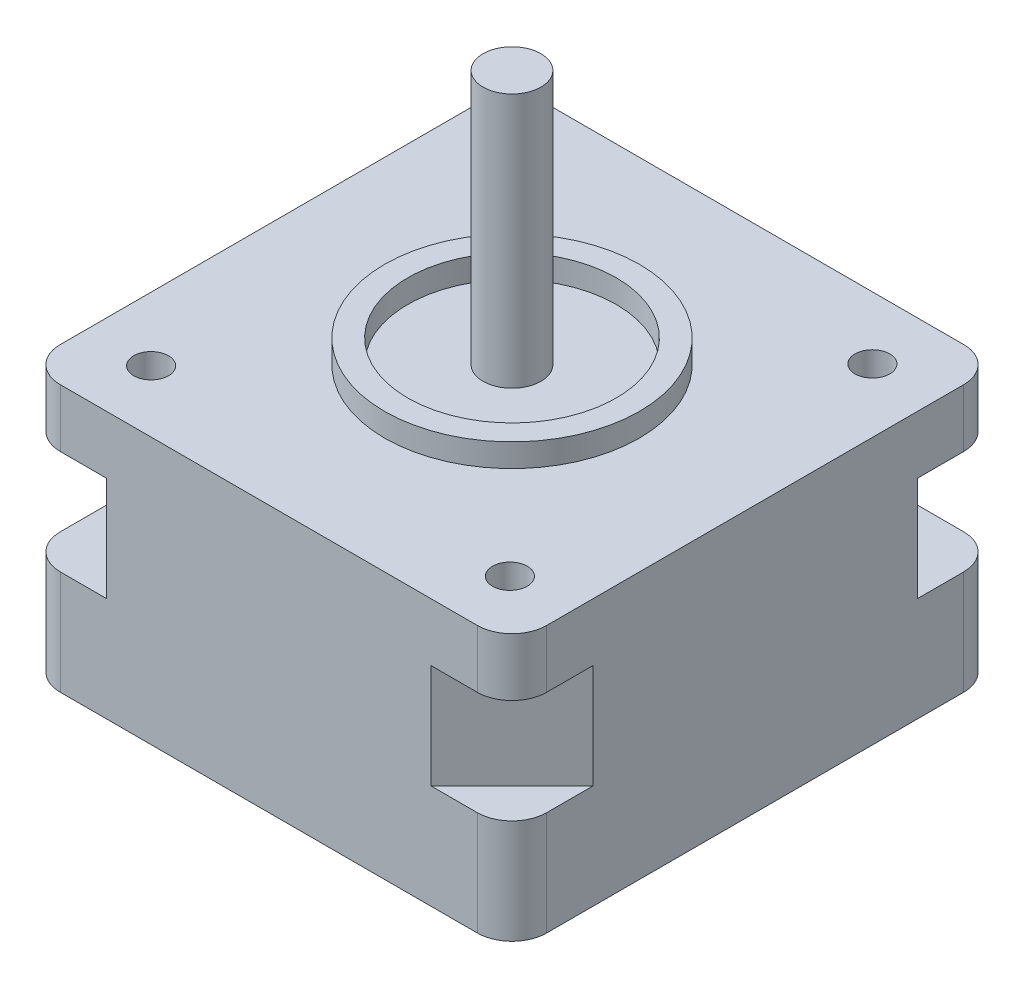
ISO-10303-21;
HEADER;
FILE_DESCRIPTION(('STEP AP214'),'2;1');
FILE_NAME('part.step','',(''),(''),'','','');
FILE_SCHEMA(('AUTOMOTIVE_DESIGN { 1 0 10303 214 1 1 1 1 }'));
ENDSEC;
DATA;
#1=APPLICATION_CONTEXT('core data for automotive mechanical design processes');
#2=APPLICATION_PROTOCOL_DEFINITION('international standard','automotive_design',2000,#1);
#3=PRODUCT_CONTEXT('',#1,'mechanical');
#4=PRODUCT('Part','Part','',(#3));
#5=PRODUCT_RELATED_PRODUCT_CATEGORY('part','',(#4));
#6=PRODUCT_DEFINITION_FORMATION('','',#4);
#7=PRODUCT_DEFINITION_CONTEXT('part definition',#1,'design');
#8=PRODUCT_DEFINITION('design','',#6,#7);
#9=PRODUCT_DEFINITION_SHAPE('','',#8);
#10=(LENGTH_UNIT() NAMED_UNIT(*) SI_UNIT(.MILLI.,.METRE.));
#11=(NAMED_UNIT(*) PLANE_ANGLE_UNIT() SI_UNIT($,.RADIAN.));
#12=(NAMED_UNIT(*) SI_UNIT($,.STERADIAN.) SOLID_ANGLE_UNIT());
#13=UNCERTAINTY_MEASURE_WITH_UNIT(LENGTH_MEASURE(1.E-05),#10,'distance_accuracy_value','');
#14=(GEOMETRIC_REPRESENTATION_CONTEXT(3) GLOBAL_UNCERTAINTY_ASSIGNED_CONTEXT((#13)) GLOBAL_UNIT_ASSIGNED_CONTEXT((#10,
#11,#12)) REPRESENTATION_CONTEXT('',''));
#15=CARTESIAN_POINT('',(0.,0.,0.));
#16=DIRECTION('',(0.,0.,1.));
#17=DIRECTION('',(1.,0.,0.));
#18=AXIS2_PLACEMENT_3D('',#15,#16,#17);
#19=CARTESIAN_POINT('',(-18.,9.,-21.));
#20=DIRECTION('',(0.,0.,1.));
#21=DIRECTION('',(1.,0.,0.));
#22=AXIS2_PLACEMENT_3D('',#19,#20,#21);
#23=PLANE('',#22);
#24=DIRECTION('',(-1.,0.,0.));
#25=VECTOR('',#24,1.);
#26=CARTESIAN_POINT('',(-18.,0.,-21.));
#27=LINE('',#26,#25);
#28=CARTESIAN_POINT('',(18.,0.,-21.));
#29=VERTEX_POINT('',#28);
#30=CARTESIAN_POINT('',(-18.,0.,-21.));
#31=VERTEX_POINT('',#30);
#32=EDGE_CURVE('E508',#29,#31,#27,.T.);
#33=ORIENTED_EDGE('',*,*,#32,.T.);
#34=DIRECTION('',(0.,-1.,0.));
#35=VECTOR('',#34,1.);
#36=CARTESIAN_POINT('',(-18.,9.,-21.));
#37=LINE('',#36,#35);
#38=CARTESIAN_POINT('',(-18.,9.,-21.));
#39=VERTEX_POINT('',#38);
#40=EDGE_CURVE('E523',#39,#31,#37,.T.);
#41=ORIENTED_EDGE('',*,*,#40,.F.);
#42=DIRECTION('',(-1.,0.,0.));
#43=VECTOR('',#42,1.);
#44=CARTESIAN_POINT('',(-18.,9.,-21.));
#45=LINE('',#44,#43);
#46=CARTESIAN_POINT('',(-14.,9.,-21.));
#47=VERTEX_POINT('',#46);
#48=EDGE_CURVE('E481',#47,#39,#45,.T.);
#49=ORIENTED_EDGE('',*,*,#48,.F.);
#50=DIRECTION('',(0.,-1.,0.));
#51=VECTOR('',#50,1.);
#52=CARTESIAN_POINT('',(-14.,18.,-21.));
#53=LINE('',#52,#51);
#54=CARTESIAN_POINT('',(-14.,18.,-21.));
#55=VERTEX_POINT('',#54);
#56=EDGE_CURVE('E457',#55,#47,#53,.T.);
#57=ORIENTED_EDGE('',*,*,#56,.F.);
#58=DIRECTION('',(-1.,0.,0.));
#59=VECTOR('',#58,1.);
#60=CARTESIAN_POINT('',(-18.,18.,-21.));
#61=LINE('',#60,#59);
#62=CARTESIAN_POINT('',(-18.,18.,-21.));
#63=VERTEX_POINT('',#62);
#64=EDGE_CURVE('E338',#55,#63,#61,.T.);
#65=ORIENTED_EDGE('',*,*,#64,.T.);
#66=DIRECTION('',(0.,-1.,0.));
#67=VECTOR('',#66,1.);
#68=CARTESIAN_POINT('',(-18.,23.,-21.));
#69=LINE('',#68,#67);
#70=CARTESIAN_POINT('',(-18.,23.,-21.));
#71=VERTEX_POINT('',#70);
#72=EDGE_CURVE('E389',#71,#63,#69,.T.);
#73=ORIENTED_EDGE('',*,*,#72,.F.);
#74=DIRECTION('',(-1.,0.,0.));
#75=VECTOR('',#74,1.);
#76=CARTESIAN_POINT('',(-18.,23.,-21.));
#77=LINE('',#76,#75);
#78=CARTESIAN_POINT('',(18.,23.,-21.));
#79=VERTEX_POINT('',#78);
#80=EDGE_CURVE('E312',#79,#71,#77,.T.);
#81=ORIENTED_EDGE('',*,*,#80,.F.);
#82=DIRECTION('',(0.,-1.,0.));
#83=VECTOR('',#82,1.);
#84=CARTESIAN_POINT('',(18.,23.,-21.));
#85=LINE('',#84,#83);
#86=CARTESIAN_POINT('',(18.,18.,-21.));
#87=VERTEX_POINT('',#86);
#88=EDGE_CURVE('E393',#79,#87,#85,.T.);
#89=ORIENTED_EDGE('',*,*,#88,.T.);
#90=CARTESIAN_POINT('',(14.,18.,-21.));
#91=VERTEX_POINT('',#90);
#92=EDGE_CURVE('E339',#87,#91,#61,.T.);
#93=ORIENTED_EDGE('',*,*,#92,.T.);
#94=DIRECTION('',(0.,-1.,0.));
#95=VECTOR('',#94,1.);
#96=CARTESIAN_POINT('',(14.,18.,-21.));
#97=LINE('',#96,#95);
#98=CARTESIAN_POINT('',(14.,9.,-21.));
#99=VERTEX_POINT('',#98);
#100=EDGE_CURVE('E415',#91,#99,#97,.T.);
#101=ORIENTED_EDGE('',*,*,#100,.T.);
#102=CARTESIAN_POINT('',(18.,9.,-21.));
#103=VERTEX_POINT('',#102);
#104=EDGE_CURVE('E482',#103,#99,#45,.T.);
#105=ORIENTED_EDGE('',*,*,#104,.F.);
#106=DIRECTION('',(0.,-1.,0.));
#107=VECTOR('',#106,1.);
#108=CARTESIAN_POINT('',(18.,9.,-21.));
#109=LINE('',#108,#107);
#110=EDGE_CURVE('E527',#103,#29,#109,.T.);
#111=ORIENTED_EDGE('',*,*,#110,.T.);
#112=EDGE_LOOP('',(#33,#41,#49,#57,#65,#73,#81,#89,#93,#101,#105,#111));
#113=FACE_BOUND('',#112,.T.);
#114=DIRECTION('',(0.,1.,0.));
#115=VECTOR('',#114,1.);
#116=CARTESIAN_POINT('',(-7.5,9.,-21.));
#117=LINE('',#116,#115);
#118=CARTESIAN_POINT('',(-7.5,4.,-21.));
#119=VERTEX_POINT('',#118);
#120=CARTESIAN_POINT('',(-7.5,9.,-21.));
#121=VERTEX_POINT('',#120);
#122=EDGE_CURVE('E247',#119,#121,#117,.T.);
#123=ORIENTED_EDGE('',*,*,#122,.F.);
#124=DIRECTION('',(-1.,0.,0.));
#125=VECTOR('',#124,1.);
#126=CARTESIAN_POINT('',(7.5,4.,-21.));
#127=LINE('',#126,#125);
#128=CARTESIAN_POINT('',(7.49999999999999,4.,-21.));
#129=VERTEX_POINT('',#128);
#130=EDGE_CURVE('E244',#129,#119,#127,.T.);
#131=ORIENTED_EDGE('',*,*,#130,.F.);
#132=DIRECTION('',(0.,-1.,0.));
#133=VECTOR('',#132,1.);
#134=CARTESIAN_POINT('',(7.5,9.,-21.));
#135=LINE('',#134,#133);
#136=CARTESIAN_POINT('',(7.5,9.,-21.));
#137=VERTEX_POINT('',#136);
#138=EDGE_CURVE('E60',#137,#129,#135,.T.);
#139=ORIENTED_EDGE('',*,*,#138,.F.);
#140=DIRECTION('',(1.,0.,0.));
#141=VECTOR('',#140,1.);
#142=CARTESIAN_POINT('',(7.5,9.,-21.));
#143=LINE('',#142,#141);
#144=EDGE_CURVE('E55',#121,#137,#143,.T.);
#145=ORIENTED_EDGE('',*,*,#144,.F.);
#146=EDGE_LOOP('',(#123,#131,#139,#145));
#147=FACE_BOUND('',#146,.T.);
#148=ADVANCED_FACE('F39',(#113,#147),#23,.F.);
#149=CARTESIAN_POINT('',(-18.,9.,18.));
#150=DIRECTION('',(0.,-1.,0.));
#151=DIRECTION('',(0.,0.,-1.));
#152=AXIS2_PLACEMENT_3D('',#149,#150,#151);
#153=PLANE('',#152);
#154=DIRECTION('',(-0.707106781186547,0.,-0.707106781186547));
#155=VECTOR('',#154,1.);
#156=CARTESIAN_POINT('',(14.,9.,-21.));
#157=LINE('',#156,#155);
#158=CARTESIAN_POINT('',(21.,9.,-14.));
#159=VERTEX_POINT('',#158);
#160=EDGE_CURVE('E403',#159,#99,#157,.T.);
#161=ORIENTED_EDGE('',*,*,#160,.F.);
#162=DIRECTION('',(0.,0.,-1.));
#163=VECTOR('',#162,1.);
#164=CARTESIAN_POINT('',(21.,9.,-18.));
#165=LINE('',#164,#163);
#166=CARTESIAN_POINT('',(21.,9.,-18.));
#167=VERTEX_POINT('',#166);
#168=EDGE_CURVE('E474',#159,#167,#165,.T.);
#169=ORIENTED_EDGE('',*,*,#168,.T.);
#170=CARTESIAN_POINT('',(18.,9.,-18.));
#171=DIRECTION('',(0.,1.,0.));
#172=DIRECTION('',(0.,0.,-1.));
#173=AXIS2_PLACEMENT_3D('',#170,#171,#172);
#174=CIRCLE('',#173,3.);
#175=EDGE_CURVE('E478',#167,#103,#174,.T.);
#176=ORIENTED_EDGE('',*,*,#175,.T.);
#177=ORIENTED_EDGE('',*,*,#104,.T.);
#178=EDGE_LOOP('',(#161,#169,#176,#177));
#179=FACE_BOUND('',#178,.T.);
#180=ADVANCED_FACE('F618',(#179),#153,.F.);
#181=DIRECTION('',(0.707106781186547,0.,-0.707106781186547));
#182=VECTOR('',#181,1.);
#183=CARTESIAN_POINT('',(21.,9.,14.));
#184=LINE('',#183,#182);
#185=CARTESIAN_POINT('',(14.,9.,21.));
#186=VERTEX_POINT('',#185);
#187=CARTESIAN_POINT('',(21.,9.,14.));
#188=VERTEX_POINT('',#187);
#189=EDGE_CURVE('E423',#186,#188,#184,.T.);
#190=ORIENTED_EDGE('',*,*,#189,.F.);
#191=DIRECTION('',(1.,0.,0.));
#192=VECTOR('',#191,1.);
#193=CARTESIAN_POINT('',(-18.,9.,21.));
#194=LINE('',#193,#192);
#195=CARTESIAN_POINT('',(18.,9.,21.));
#196=VERTEX_POINT('',#195);
#197=EDGE_CURVE('E466',#186,#196,#194,.T.);
#198=ORIENTED_EDGE('',*,*,#197,.T.);
#199=CARTESIAN_POINT('',(18.,9.,18.));
#200=DIRECTION('',(0.,1.,0.));
#201=DIRECTION('',(0.,0.,1.));
#202=AXIS2_PLACEMENT_3D('',#199,#200,#201);
#203=CIRCLE('',#202,3.);
#204=CARTESIAN_POINT('',(21.,9.,18.));
#205=VERTEX_POINT('',#204);
#206=EDGE_CURVE('E471',#196,#205,#203,.T.);
#207=ORIENTED_EDGE('',*,*,#206,.T.);
#208=EDGE_CURVE('E475',#205,#188,#165,.T.);
#209=ORIENTED_EDGE('',*,*,#208,.T.);
#210=EDGE_LOOP('',(#190,#198,#207,#209));
#211=FACE_BOUND('',#210,.T.);
#212=ADVANCED_FACE('F568',(#211),#153,.F.);
#213=DIRECTION('',(0.707106781186547,0.,0.707106781186547));
#214=VECTOR('',#213,1.);
#215=CARTESIAN_POINT('',(-21.,9.,14.));
#216=LINE('',#215,#214);
#217=CARTESIAN_POINT('',(-21.,9.,14.));
#218=VERTEX_POINT('',#217);
#219=CARTESIAN_POINT('',(-14.,9.,21.));
#220=VERTEX_POINT('',#219);
#221=EDGE_CURVE('E419',#218,#220,#216,.T.);
#222=ORIENTED_EDGE('',*,*,#221,.F.);
#223=DIRECTION('',(0.,0.,1.));
#224=VECTOR('',#223,1.);
#225=CARTESIAN_POINT('',(-21.,9.,-18.));
#226=LINE('',#225,#224);
#227=CARTESIAN_POINT('',(-21.,9.,18.));
#228=VERTEX_POINT('',#227);
#229=EDGE_CURVE('E488',#218,#228,#226,.T.);
#230=ORIENTED_EDGE('',*,*,#229,.T.);
#231=CARTESIAN_POINT('',(-18.,9.,18.));
#232=DIRECTION('',(0.,1.,0.));
#233=DIRECTION('',(0.,0.,-1.));
#234=AXIS2_PLACEMENT_3D('',#231,#232,#233);
#235=CIRCLE('',#234,3.);
#236=CARTESIAN_POINT('',(-18.,9.,21.));
#237=VERTEX_POINT('',#236);
#238=EDGE_CURVE('E462',#228,#237,#235,.T.);
#239=ORIENTED_EDGE('',*,*,#238,.T.);
#240=EDGE_CURVE('E468',#237,#220,#194,.T.);
#241=ORIENTED_EDGE('',*,*,#240,.T.);
#242=EDGE_LOOP('',(#222,#230,#239,#241));
#243=FACE_BOUND('',#242,.T.);
#244=ADVANCED_FACE('F635',(#243),#153,.F.);
#245=DIRECTION('',(-0.707106781186547,0.,0.707106781186547));
#246=VECTOR('',#245,1.);
#247=CARTESIAN_POINT('',(-21.,9.,-14.));
#248=LINE('',#247,#246);
#249=CARTESIAN_POINT('',(-21.,9.,-14.));
#250=VERTEX_POINT('',#249);
#251=EDGE_CURVE('E397',#47,#250,#248,.T.);
#252=ORIENTED_EDGE('',*,*,#251,.F.);
#253=ORIENTED_EDGE('',*,*,#48,.T.);
#254=CARTESIAN_POINT('',(-18.,9.,-18.));
#255=DIRECTION('',(0.,1.,0.));
#256=DIRECTION('',(0.,0.,-1.));
#257=AXIS2_PLACEMENT_3D('',#254,#255,#256);
#258=CIRCLE('',#257,3.);
#259=CARTESIAN_POINT('',(-21.,9.,-18.));
#260=VERTEX_POINT('',#259);
#261=EDGE_CURVE('E485',#39,#260,#258,.T.);
#262=ORIENTED_EDGE('',*,*,#261,.T.);
#263=EDGE_CURVE('E489',#260,#250,#226,.T.);
#264=ORIENTED_EDGE('',*,*,#263,.T.);
#265=EDGE_LOOP('',(#252,#253,#262,#264));
#266=FACE_BOUND('',#265,.T.);
#267=ADVANCED_FACE('F629',(#266),#153,.F.);
#268=CARTESIAN_POINT('',(-18.,9.,18.));
#269=DIRECTION('',(0.,-1.,0.));
#270=DIRECTION('',(0.,0.,-1.));
#271=AXIS2_PLACEMENT_3D('',#268,#269,#270);
#272=CYLINDRICAL_SURFACE('',#271,3.);
#273=CARTESIAN_POINT('',(-18.,0.,18.));
#274=DIRECTION('',(0.,1.,0.));
#275=DIRECTION('',(0.,0.,-1.));
#276=AXIS2_PLACEMENT_3D('',#273,#274,#275);
#277=CIRCLE('',#276,3.);
#278=CARTESIAN_POINT('',(-21.,0.,18.));
#279=VERTEX_POINT('',#278);
#280=CARTESIAN_POINT('',(-18.,0.,21.));
#281=VERTEX_POINT('',#280);
#282=EDGE_CURVE('E461',#279,#281,#277,.T.);
#283=ORIENTED_EDGE('',*,*,#282,.T.);
#284=DIRECTION('',(0.,-1.,0.));
#285=VECTOR('',#284,1.);
#286=CARTESIAN_POINT('',(-18.,9.,21.));
#287=LINE('',#286,#285);
#288=EDGE_CURVE('E48',#237,#281,#287,.T.);
#289=ORIENTED_EDGE('',*,*,#288,.F.);
#290=ORIENTED_EDGE('',*,*,#238,.F.);
#291=DIRECTION('',(0.,-1.,0.));
#292=VECTOR('',#291,1.);
#293=CARTESIAN_POINT('',(-21.,9.,18.));
#294=LINE('',#293,#292);
#295=EDGE_CURVE('E492',#228,#279,#294,.T.);
#296=ORIENTED_EDGE('',*,*,#295,.T.);
#297=EDGE_LOOP('',(#283,#289,#290,#296));
#298=FACE_BOUND('',#297,.T.);
#299=ADVANCED_FACE('F41',(#298),#272,.T.);
#300=CARTESIAN_POINT('',(-18.,9.,21.));
#301=DIRECTION('',(0.,0.,-1.));
#302=DIRECTION('',(-1.,0.,0.));
#303=AXIS2_PLACEMENT_3D('',#300,#301,#302);
#304=PLANE('',#303);
#305=DIRECTION('',(1.,0.,0.));
#306=VECTOR('',#305,1.);
#307=CARTESIAN_POINT('',(-18.,0.,21.));
#308=LINE('',#307,#306);
#309=CARTESIAN_POINT('',(18.,0.,21.));
#310=VERTEX_POINT('',#309);
#311=EDGE_CURVE('E496',#281,#310,#308,.T.);
#312=ORIENTED_EDGE('',*,*,#311,.T.);
#313=DIRECTION('',(0.,-1.,0.));
#314=VECTOR('',#313,1.);
#315=CARTESIAN_POINT('',(18.,9.,21.));
#316=LINE('',#315,#314);
#317=EDGE_CURVE('E539',#196,#310,#316,.T.);
#318=ORIENTED_EDGE('',*,*,#317,.F.);
#319=ORIENTED_EDGE('',*,*,#197,.F.);
#320=DIRECTION('',(0.,-1.,0.));
#321=VECTOR('',#320,1.);
#322=CARTESIAN_POINT('',(14.,18.,21.));
#323=LINE('',#322,#321);
#324=CARTESIAN_POINT('',(14.,18.,21.));
#325=VERTEX_POINT('',#324);
#326=EDGE_CURVE('E441',#325,#186,#323,.T.);
#327=ORIENTED_EDGE('',*,*,#326,.F.);
#328=DIRECTION('',(1.,0.,0.));
#329=VECTOR('',#328,1.);
#330=CARTESIAN_POINT('',(-18.,18.,21.));
#331=LINE('',#330,#329);
#332=CARTESIAN_POINT('',(18.,18.,21.));
#333=VERTEX_POINT('',#332);
#334=EDGE_CURVE('E354',#325,#333,#331,.T.);
#335=ORIENTED_EDGE('',*,*,#334,.T.);
#336=DIRECTION('',(0.,-1.,0.));
#337=VECTOR('',#336,1.);
#338=CARTESIAN_POINT('',(18.,23.,21.));
#339=LINE('',#338,#337);
#340=CARTESIAN_POINT('',(18.,23.,21.));
#341=VERTEX_POINT('',#340);
#342=EDGE_CURVE('E373',#341,#333,#339,.T.);
#343=ORIENTED_EDGE('',*,*,#342,.F.);
#344=DIRECTION('',(1.,0.,0.));
#345=VECTOR('',#344,1.);
#346=CARTESIAN_POINT('',(-18.,23.,21.));
#347=LINE('',#346,#345);
#348=CARTESIAN_POINT('',(-18.,23.,21.));
#349=VERTEX_POINT('',#348);
#350=EDGE_CURVE('E325',#349,#341,#347,.T.);
#351=ORIENTED_EDGE('',*,*,#350,.F.);
#352=DIRECTION('',(0.,-1.,0.));
#353=VECTOR('',#352,1.);
#354=CARTESIAN_POINT('',(-18.,23.,21.));
#355=LINE('',#354,#353);
#356=CARTESIAN_POINT('',(-18.,18.,21.));
#357=VERTEX_POINT('',#356);
#358=EDGE_CURVE('E377',#349,#357,#355,.T.);
#359=ORIENTED_EDGE('',*,*,#358,.T.);
#360=CARTESIAN_POINT('',(-14.,18.,21.));
#361=VERTEX_POINT('',#360);
#362=EDGE_CURVE('E355',#357,#361,#331,.T.);
#363=ORIENTED_EDGE('',*,*,#362,.T.);
#364=DIRECTION('',(0.,-1.,0.));
#365=VECTOR('',#364,1.);
#366=CARTESIAN_POINT('',(-14.,18.,21.));
#367=LINE('',#366,#365);
#368=EDGE_CURVE('E445',#361,#220,#367,.T.);
#369=ORIENTED_EDGE('',*,*,#368,.T.);
#370=ORIENTED_EDGE('',*,*,#240,.F.);
#371=ORIENTED_EDGE('',*,*,#288,.T.);
#372=EDGE_LOOP('',(#312,#318,#319,#327,#335,#343,#351,#359,#363,#369,#370,#371));
#373=FACE_BOUND('',#372,.T.);
#374=ADVANCED_FACE('F546',(#373),#304,.F.);
#375=CARTESIAN_POINT('',(18.,9.,18.));
#376=DIRECTION('',(0.,-1.,0.));
#377=DIRECTION('',(0.,0.,-1.));
#378=AXIS2_PLACEMENT_3D('',#375,#376,#377);
#379=CYLINDRICAL_SURFACE('',#378,3.);
#380=CARTESIAN_POINT('',(18.,0.,18.));
#381=DIRECTION('',(0.,1.,0.));
#382=DIRECTION('',(0.,0.,1.));
#383=AXIS2_PLACEMENT_3D('',#380,#381,#382);
#384=CIRCLE('',#383,3.);
#385=CARTESIAN_POINT('',(21.,0.,18.));
#386=VERTEX_POINT('',#385);
#387=EDGE_CURVE('E499',#310,#386,#384,.T.);
#388=ORIENTED_EDGE('',*,*,#387,.T.);
#389=DIRECTION('',(0.,-1.,0.));
#390=VECTOR('',#389,1.);
#391=CARTESIAN_POINT('',(21.,9.,18.));
#392=LINE('',#391,#390);
#393=EDGE_CURVE('E535',#205,#386,#392,.T.);
#394=ORIENTED_EDGE('',*,*,#393,.F.);
#395=ORIENTED_EDGE('',*,*,#206,.F.);
#396=ORIENTED_EDGE('',*,*,#317,.T.);
#397=EDGE_LOOP('',(#388,#394,#395,#396));
#398=FACE_BOUND('',#397,.T.);
#399=ADVANCED_FACE('F561',(#398),#379,.T.);
#400=CARTESIAN_POINT('',(21.,9.,-18.));
#401=DIRECTION('',(-1.,0.,0.));
#402=DIRECTION('',(0.,0.,1.));
#403=AXIS2_PLACEMENT_3D('',#400,#401,#402);
#404=PLANE('',#403);
#405=DIRECTION('',(0.,0.,-1.));
#406=VECTOR('',#405,1.);
#407=CARTESIAN_POINT('',(21.,0.,-18.));
#408=LINE('',#407,#406);
#409=CARTESIAN_POINT('',(21.,0.,-18.));
#410=VERTEX_POINT('',#409);
#411=EDGE_CURVE('E502',#386,#410,#408,.T.);
#412=ORIENTED_EDGE('',*,*,#411,.T.);
#413=DIRECTION('',(0.,-1.,0.));
#414=VECTOR('',#413,1.);
#415=CARTESIAN_POINT('',(21.,9.,-18.));
#416=LINE('',#415,#414);
#417=EDGE_CURVE('E531',#167,#410,#416,.T.);
#418=ORIENTED_EDGE('',*,*,#417,.F.);
#419=ORIENTED_EDGE('',*,*,#168,.F.);
#420=DIRECTION('',(0.,-1.,0.));
#421=VECTOR('',#420,1.);
#422=CARTESIAN_POINT('',(21.,18.,-14.));
#423=LINE('',#422,#421);
#424=CARTESIAN_POINT('',(21.,18.,-14.));
#425=VERTEX_POINT('',#424);
#426=EDGE_CURVE('E433',#425,#159,#423,.T.);
#427=ORIENTED_EDGE('',*,*,#426,.F.);
#428=DIRECTION('',(0.,0.,-1.));
#429=VECTOR('',#428,1.);
#430=CARTESIAN_POINT('',(21.,18.,-18.));
#431=LINE('',#430,#429);
#432=CARTESIAN_POINT('',(21.,18.,-18.));
#433=VERTEX_POINT('',#432);
#434=EDGE_CURVE('E362',#425,#433,#431,.T.);
#435=ORIENTED_EDGE('',*,*,#434,.T.);
#436=DIRECTION('',(0.,-1.,0.));
#437=VECTOR('',#436,1.);
#438=CARTESIAN_POINT('',(21.,23.,-18.));
#439=LINE('',#438,#437);
#440=CARTESIAN_POINT('',(21.,23.,-18.));
#441=VERTEX_POINT('',#440);
#442=EDGE_CURVE('E334',#441,#433,#439,.T.);
#443=ORIENTED_EDGE('',*,*,#442,.F.);
#444=DIRECTION('',(0.,0.,-1.));
#445=VECTOR('',#444,1.);
#446=CARTESIAN_POINT('',(21.,23.,-18.));
#447=LINE('',#446,#445);
#448=CARTESIAN_POINT('',(21.,23.,18.));
#449=VERTEX_POINT('',#448);
#450=EDGE_CURVE('E331',#449,#441,#447,.T.);
#451=ORIENTED_EDGE('',*,*,#450,.F.);
#452=DIRECTION('',(0.,-1.,0.));
#453=VECTOR('',#452,1.);
#454=CARTESIAN_POINT('',(21.,23.,18.));
#455=LINE('',#454,#453);
#456=CARTESIAN_POINT('',(21.,18.,18.));
#457=VERTEX_POINT('',#456);
#458=EDGE_CURVE('E369',#449,#457,#455,.T.);
#459=ORIENTED_EDGE('',*,*,#458,.T.);
#460=CARTESIAN_POINT('',(21.,18.,14.));
#461=VERTEX_POINT('',#460);
#462=EDGE_CURVE('E313',#457,#461,#431,.T.);
#463=ORIENTED_EDGE('',*,*,#462,.T.);
#464=DIRECTION('',(0.,-1.,0.));
#465=VECTOR('',#464,1.);
#466=CARTESIAN_POINT('',(21.,18.,14.));
#467=LINE('',#466,#465);
#468=EDGE_CURVE('E437',#461,#188,#467,.T.);
#469=ORIENTED_EDGE('',*,*,#468,.T.);
#470=ORIENTED_EDGE('',*,*,#208,.F.);
#471=ORIENTED_EDGE('',*,*,#393,.T.);
#472=EDGE_LOOP('',(#412,#418,#419,#427,#435,#443,#451,#459,#463,#469,#470,#471));
#473=FACE_BOUND('',#472,.T.);
#474=ADVANCED_FACE('F565',(#473),#404,.F.);
#475=CARTESIAN_POINT('',(18.,9.,-18.));
#476=DIRECTION('',(0.,-1.,0.));
#477=DIRECTION('',(0.,0.,-1.));
#478=AXIS2_PLACEMENT_3D('',#475,#476,#477);
#479=CYLINDRICAL_SURFACE('',#478,3.);
#480=CARTESIAN_POINT('',(18.,0.,-18.));
#481=DIRECTION('',(0.,1.,0.));
#482=DIRECTION('',(0.,0.,-1.));
#483=AXIS2_PLACEMENT_3D('',#480,#481,#482);
#484=CIRCLE('',#483,3.);
#485=EDGE_CURVE('E505',#410,#29,#484,.T.);
#486=ORIENTED_EDGE('',*,*,#485,.T.);
#487=ORIENTED_EDGE('',*,*,#110,.F.);
#488=ORIENTED_EDGE('',*,*,#175,.F.);
#489=ORIENTED_EDGE('',*,*,#417,.T.);
#490=EDGE_LOOP('',(#486,#487,#488,#489));
#491=FACE_BOUND('',#490,.T.);
#492=ADVANCED_FACE('F622',(#491),#479,.T.);
#493=CARTESIAN_POINT('',(-18.,9.,-18.));
#494=DIRECTION('',(0.,-1.,0.));
#495=DIRECTION('',(0.,0.,-1.));
#496=AXIS2_PLACEMENT_3D('',#493,#494,#495);
#497=CYLINDRICAL_SURFACE('',#496,3.);
#498=CARTESIAN_POINT('',(-18.,0.,-18.));
#499=DIRECTION('',(0.,1.,0.));
#500=DIRECTION('',(0.,0.,-1.));
#501=AXIS2_PLACEMENT_3D('',#498,#499,#500);
#502=CIRCLE('',#501,3.);
#503=CARTESIAN_POINT('',(-21.,0.,-18.));
#504=VERTEX_POINT('',#503);
#505=EDGE_CURVE('E511',#31,#504,#502,.T.);
#506=ORIENTED_EDGE('',*,*,#505,.T.);
#507=DIRECTION('',(0.,-1.,0.));
#508=VECTOR('',#507,1.);
#509=CARTESIAN_POINT('',(-21.,9.,-18.));
#510=LINE('',#509,#508);
#511=EDGE_CURVE('E519',#260,#504,#510,.T.);
#512=ORIENTED_EDGE('',*,*,#511,.F.);
#513=ORIENTED_EDGE('',*,*,#261,.F.);
#514=ORIENTED_EDGE('',*,*,#40,.T.);
#515=EDGE_LOOP('',(#506,#512,#513,#514));
#516=FACE_BOUND('',#515,.T.);
#517=ADVANCED_FACE('F626',(#516),#497,.T.);
#518=CARTESIAN_POINT('',(-21.,9.,-18.));
#519=DIRECTION('',(1.,0.,0.));
#520=DIRECTION('',(0.,0.,-1.));
#521=AXIS2_PLACEMENT_3D('',#518,#519,#520);
#522=PLANE('',#521);
#523=DIRECTION('',(0.,0.,1.));
#524=VECTOR('',#523,1.);
#525=CARTESIAN_POINT('',(-21.,0.,-18.));
#526=LINE('',#525,#524);
#527=EDGE_CURVE('E467',#504,#279,#526,.T.);
#528=ORIENTED_EDGE('',*,*,#527,.T.);
#529=ORIENTED_EDGE('',*,*,#295,.F.);
#530=ORIENTED_EDGE('',*,*,#229,.F.);
#531=DIRECTION('',(0.,-1.,0.));
#532=VECTOR('',#531,1.);
#533=CARTESIAN_POINT('',(-21.,18.,14.));
#534=LINE('',#533,#532);
#535=CARTESIAN_POINT('',(-21.,18.,14.));
#536=VERTEX_POINT('',#535);
#537=EDGE_CURVE('E449',#536,#218,#534,.T.);
#538=ORIENTED_EDGE('',*,*,#537,.F.);
#539=DIRECTION('',(0.,0.,1.));
#540=VECTOR('',#539,1.);
#541=CARTESIAN_POINT('',(-21.,18.,-18.));
#542=LINE('',#541,#540);
#543=CARTESIAN_POINT('',(-21.,18.,18.));
#544=VERTEX_POINT('',#543);
#545=EDGE_CURVE('E346',#536,#544,#542,.T.);
#546=ORIENTED_EDGE('',*,*,#545,.T.);
#547=DIRECTION('',(0.,-1.,0.));
#548=VECTOR('',#547,1.);
#549=CARTESIAN_POINT('',(-21.,23.,18.));
#550=LINE('',#549,#548);
#551=CARTESIAN_POINT('',(-21.,23.,18.));
#552=VERTEX_POINT('',#551);
#553=EDGE_CURVE('E381',#552,#544,#550,.T.);
#554=ORIENTED_EDGE('',*,*,#553,.F.);
#555=DIRECTION('',(0.,0.,1.));
#556=VECTOR('',#555,1.);
#557=CARTESIAN_POINT('',(-21.,23.,-18.));
#558=LINE('',#557,#556);
#559=CARTESIAN_POINT('',(-21.,23.,-18.));
#560=VERTEX_POINT('',#559);
#561=EDGE_CURVE('E319',#560,#552,#558,.T.);
#562=ORIENTED_EDGE('',*,*,#561,.F.);
#563=DIRECTION('',(0.,-1.,0.));
#564=VECTOR('',#563,1.);
#565=CARTESIAN_POINT('',(-21.,23.,-18.));
#566=LINE('',#565,#564);
#567=CARTESIAN_POINT('',(-21.,18.,-18.));
#568=VERTEX_POINT('',#567);
#569=EDGE_CURVE('E385',#560,#568,#566,.T.);
#570=ORIENTED_EDGE('',*,*,#569,.T.);
#571=CARTESIAN_POINT('',(-21.,18.,-14.));
#572=VERTEX_POINT('',#571);
#573=EDGE_CURVE('E347',#568,#572,#542,.T.);
#574=ORIENTED_EDGE('',*,*,#573,.T.);
#575=DIRECTION('',(0.,-1.,0.));
#576=VECTOR('',#575,1.);
#577=CARTESIAN_POINT('',(-21.,18.,-14.));
#578=LINE('',#577,#576);
#579=EDGE_CURVE('E453',#572,#250,#578,.T.);
#580=ORIENTED_EDGE('',*,*,#579,.T.);
#581=ORIENTED_EDGE('',*,*,#263,.F.);
#582=ORIENTED_EDGE('',*,*,#511,.T.);
#583=EDGE_LOOP('',(#528,#529,#530,#538,#546,#554,#562,#570,#574,#580,#581,#582));
#584=FACE_BOUND('',#583,.T.);
#585=ADVANCED_FACE('F594',(#584),#522,.F.);
#586=CARTESIAN_POINT('',(-18.,0.,18.));
#587=DIRECTION('',(0.,-1.,0.));
#588=DIRECTION('',(0.,0.,-1.));
#589=AXIS2_PLACEMENT_3D('',#586,#587,#588);
#590=PLANE('',#589);
#591=ORIENTED_EDGE('',*,*,#282,.F.);
#592=ORIENTED_EDGE('',*,*,#527,.F.);
#593=ORIENTED_EDGE('',*,*,#505,.F.);
#594=ORIENTED_EDGE('',*,*,#32,.F.);
#595=ORIENTED_EDGE('',*,*,#485,.F.);
#596=ORIENTED_EDGE('',*,*,#411,.F.);
#597=ORIENTED_EDGE('',*,*,#387,.F.);
#598=ORIENTED_EDGE('',*,*,#311,.F.);
#599=EDGE_LOOP('',(#591,#592,#593,#594,#595,#596,#597,#598));
#600=FACE_BOUND('',#599,.T.);
#601=ADVANCED_FACE('F554',(#600),#590,.T.);
#602=CARTESIAN_POINT('',(-21.,18.,-14.));
#603=DIRECTION('',(0.707106781186547,0.,0.707106781186547));
#604=DIRECTION('',(0.707106781186548,0.,-0.707106781186548));
#605=AXIS2_PLACEMENT_3D('',#602,#603,#604);
#606=PLANE('',#605);
#607=ORIENTED_EDGE('',*,*,#251,.T.);
#608=ORIENTED_EDGE('',*,*,#579,.F.);
#609=DIRECTION('',(-0.707106781186547,0.,0.707106781186547));
#610=VECTOR('',#609,1.);
#611=CARTESIAN_POINT('',(-21.,18.,-14.));
#612=LINE('',#611,#610);
#613=EDGE_CURVE('E398',#55,#572,#612,.T.);
#614=ORIENTED_EDGE('',*,*,#613,.F.);
#615=ORIENTED_EDGE('',*,*,#56,.T.);
#616=EDGE_LOOP('',(#607,#608,#614,#615));
#617=FACE_BOUND('',#616,.T.);
#618=ADVANCED_FACE('F690',(#617),#606,.F.);
#619=CARTESIAN_POINT('',(-21.,18.,14.));
#620=DIRECTION('',(0.707106781186547,0.,-0.707106781186547));
#621=DIRECTION('',(-0.707106781186548,0.,-0.707106781186548));
#622=AXIS2_PLACEMENT_3D('',#619,#620,#621);
#623=PLANE('',#622);
#624=ORIENTED_EDGE('',*,*,#221,.T.);
#625=ORIENTED_EDGE('',*,*,#368,.F.);
#626=DIRECTION('',(0.707106781186547,0.,0.707106781186547));
#627=VECTOR('',#626,1.);
#628=CARTESIAN_POINT('',(-21.,18.,14.));
#629=LINE('',#628,#627);
#630=EDGE_CURVE('E402',#536,#361,#629,.T.);
#631=ORIENTED_EDGE('',*,*,#630,.F.);
#632=ORIENTED_EDGE('',*,*,#537,.T.);
#633=EDGE_LOOP('',(#624,#625,#631,#632));
#634=FACE_BOUND('',#633,.T.);
#635=ADVANCED_FACE('F638',(#634),#623,.F.);
#636=CARTESIAN_POINT('',(21.,18.,14.));
#637=DIRECTION('',(-0.707106781186547,0.,-0.707106781186547));
#638=DIRECTION('',(-0.707106781186548,0.,0.707106781186548));
#639=AXIS2_PLACEMENT_3D('',#636,#637,#638);
#640=PLANE('',#639);
#641=ORIENTED_EDGE('',*,*,#189,.T.);
#642=ORIENTED_EDGE('',*,*,#468,.F.);
#643=DIRECTION('',(0.707106781186547,0.,-0.707106781186547));
#644=VECTOR('',#643,1.);
#645=CARTESIAN_POINT('',(21.,18.,14.));
#646=LINE('',#645,#644);
#647=EDGE_CURVE('E407',#325,#461,#646,.T.);
#648=ORIENTED_EDGE('',*,*,#647,.F.);
#649=ORIENTED_EDGE('',*,*,#326,.T.);
#650=EDGE_LOOP('',(#641,#642,#648,#649));
#651=FACE_BOUND('',#650,.T.);
#652=ADVANCED_FACE('F571',(#651),#640,.F.);
#653=CARTESIAN_POINT('',(14.,18.,-21.));
#654=DIRECTION('',(-0.707106781186547,0.,0.707106781186547));
#655=DIRECTION('',(0.707106781186548,0.,0.707106781186548));
#656=AXIS2_PLACEMENT_3D('',#653,#654,#655);
#657=PLANE('',#656);
#658=ORIENTED_EDGE('',*,*,#160,.T.);
#659=ORIENTED_EDGE('',*,*,#100,.F.);
#660=DIRECTION('',(-0.707106781186547,0.,-0.707106781186547));
#661=VECTOR('',#660,1.);
#662=CARTESIAN_POINT('',(14.,18.,-21.));
#663=LINE('',#662,#661);
#664=EDGE_CURVE('E411',#425,#91,#663,.T.);
#665=ORIENTED_EDGE('',*,*,#664,.F.);
#666=ORIENTED_EDGE('',*,*,#426,.T.);
#667=EDGE_LOOP('',(#658,#659,#665,#666));
#668=FACE_BOUND('',#667,.T.);
#669=ADVANCED_FACE('F613',(#668),#657,.F.);
#670=CARTESIAN_POINT('',(18.,18.,-18.));
#671=DIRECTION('',(0.,1.,0.));
#672=DIRECTION('',(0.,0.,1.));
#673=AXIS2_PLACEMENT_3D('',#670,#671,#672);
#674=PLANE('',#673);
#675=ORIENTED_EDGE('',*,*,#64,.F.);
#676=ORIENTED_EDGE('',*,*,#613,.T.);
#677=ORIENTED_EDGE('',*,*,#573,.F.);
#678=CARTESIAN_POINT('',(-18.,18.,-18.));
#679=DIRECTION('',(0.,1.,0.));
#680=DIRECTION('',(0.,0.,-1.));
#681=AXIS2_PLACEMENT_3D('',#678,#679,#680);
#682=CIRCLE('',#681,3.);
#683=EDGE_CURVE('E343',#63,#568,#682,.T.);
#684=ORIENTED_EDGE('',*,*,#683,.F.);
#685=EDGE_LOOP('',(#675,#676,#677,#684));
#686=FACE_BOUND('',#685,.T.);
#687=ADVANCED_FACE('F592',(#686),#674,.F.);
#688=ORIENTED_EDGE('',*,*,#545,.F.);
#689=ORIENTED_EDGE('',*,*,#630,.T.);
#690=ORIENTED_EDGE('',*,*,#362,.F.);
#691=CARTESIAN_POINT('',(-18.,18.,18.));
#692=DIRECTION('',(0.,1.,0.));
#693=DIRECTION('',(0.,0.,-1.));
#694=AXIS2_PLACEMENT_3D('',#691,#692,#693);
#695=CIRCLE('',#694,3.);
#696=EDGE_CURVE('E351',#544,#357,#695,.T.);
#697=ORIENTED_EDGE('',*,*,#696,.F.);
#698=EDGE_LOOP('',(#688,#689,#690,#697));
#699=FACE_BOUND('',#698,.T.);
#700=ADVANCED_FACE('F643',(#699),#674,.F.);
#701=ORIENTED_EDGE('',*,*,#334,.F.);
#702=ORIENTED_EDGE('',*,*,#647,.T.);
#703=ORIENTED_EDGE('',*,*,#462,.F.);
#704=CARTESIAN_POINT('',(18.,18.,18.));
#705=DIRECTION('',(0.,1.,0.));
#706=DIRECTION('',(0.,0.,1.));
#707=AXIS2_PLACEMENT_3D('',#704,#705,#706);
#708=CIRCLE('',#707,3.);
#709=EDGE_CURVE('E359',#333,#457,#708,.T.);
#710=ORIENTED_EDGE('',*,*,#709,.F.);
#711=EDGE_LOOP('',(#701,#702,#703,#710));
#712=FACE_BOUND('',#711,.T.);
#713=ADVANCED_FACE('F655',(#712),#674,.F.);
#714=ORIENTED_EDGE('',*,*,#434,.F.);
#715=ORIENTED_EDGE('',*,*,#664,.T.);
#716=ORIENTED_EDGE('',*,*,#92,.F.);
#717=CARTESIAN_POINT('',(18.,18.,-18.));
#718=DIRECTION('',(0.,1.,0.));
#719=DIRECTION('',(0.,0.,1.));
#720=AXIS2_PLACEMENT_3D('',#717,#718,#719);
#721=CIRCLE('',#720,3.);
#722=EDGE_CURVE('E304',#433,#87,#721,.T.);
#723=ORIENTED_EDGE('',*,*,#722,.F.);
#724=EDGE_LOOP('',(#714,#715,#716,#723));
#725=FACE_BOUND('',#724,.T.);
#726=ADVANCED_FACE('F610',(#725),#674,.F.);
#727=CARTESIAN_POINT('',(18.,23.,-18.));
#728=DIRECTION('',(0.,-1.,0.));
#729=DIRECTION('',(0.,0.,-1.));
#730=AXIS2_PLACEMENT_3D('',#727,#728,#729);
#731=CYLINDRICAL_SURFACE('',#730,3.);
#732=ORIENTED_EDGE('',*,*,#722,.T.);
#733=ORIENTED_EDGE('',*,*,#88,.F.);
#734=CARTESIAN_POINT('',(18.,23.,-18.));
#735=DIRECTION('',(0.,1.,0.));
#736=DIRECTION('',(0.,0.,1.));
#737=AXIS2_PLACEMENT_3D('',#734,#735,#736);
#738=CIRCLE('',#737,3.);
#739=EDGE_CURVE('E308',#441,#79,#738,.T.);
#740=ORIENTED_EDGE('',*,*,#739,.F.);
#741=ORIENTED_EDGE('',*,*,#442,.T.);
#742=EDGE_LOOP('',(#732,#733,#740,#741));
#743=FACE_BOUND('',#742,.T.);
#744=ADVANCED_FACE('F606',(#743),#731,.T.);
#745=CARTESIAN_POINT('',(-18.,23.,-18.));
#746=DIRECTION('',(0.,-1.,0.));
#747=DIRECTION('',(0.,0.,-1.));
#748=AXIS2_PLACEMENT_3D('',#745,#746,#747);
#749=CYLINDRICAL_SURFACE('',#748,3.);
#750=ORIENTED_EDGE('',*,*,#683,.T.);
#751=ORIENTED_EDGE('',*,*,#569,.F.);
#752=CARTESIAN_POINT('',(-18.,23.,-18.));
#753=DIRECTION('',(0.,1.,0.));
#754=DIRECTION('',(0.,0.,-1.));
#755=AXIS2_PLACEMENT_3D('',#752,#753,#754);
#756=CIRCLE('',#755,3.);
#757=EDGE_CURVE('E316',#71,#560,#756,.T.);
#758=ORIENTED_EDGE('',*,*,#757,.F.);
#759=ORIENTED_EDGE('',*,*,#72,.T.);
#760=EDGE_LOOP('',(#750,#751,#758,#759));
#761=FACE_BOUND('',#760,.T.);
#762=ADVANCED_FACE('F589',(#761),#749,.T.);
#763=CARTESIAN_POINT('',(-18.,23.,18.));
#764=DIRECTION('',(0.,-1.,0.));
#765=DIRECTION('',(0.,0.,-1.));
#766=AXIS2_PLACEMENT_3D('',#763,#764,#765);
#767=CYLINDRICAL_SURFACE('',#766,3.);
#768=ORIENTED_EDGE('',*,*,#696,.T.);
#769=ORIENTED_EDGE('',*,*,#358,.F.);
#770=CARTESIAN_POINT('',(-18.,23.,18.));
#771=DIRECTION('',(0.,1.,0.));
#772=DIRECTION('',(0.,0.,-1.));
#773=AXIS2_PLACEMENT_3D('',#770,#771,#772);
#774=CIRCLE('',#773,3.);
#775=EDGE_CURVE('E322',#552,#349,#774,.T.);
#776=ORIENTED_EDGE('',*,*,#775,.F.);
#777=ORIENTED_EDGE('',*,*,#553,.T.);
#778=EDGE_LOOP('',(#768,#769,#776,#777));
#779=FACE_BOUND('',#778,.T.);
#780=ADVANCED_FACE('F645',(#779),#767,.T.);
#781=CARTESIAN_POINT('',(18.,23.,18.));
#782=DIRECTION('',(0.,-1.,0.));
#783=DIRECTION('',(0.,0.,-1.));
#784=AXIS2_PLACEMENT_3D('',#781,#782,#783);
#785=CYLINDRICAL_SURFACE('',#784,3.);
#786=ORIENTED_EDGE('',*,*,#709,.T.);
#787=ORIENTED_EDGE('',*,*,#458,.F.);
#788=CARTESIAN_POINT('',(18.,23.,18.));
#789=DIRECTION('',(0.,1.,0.));
#790=DIRECTION('',(0.,0.,1.));
#791=AXIS2_PLACEMENT_3D('',#788,#789,#790);
#792=CIRCLE('',#791,3.);
#793=EDGE_CURVE('E328',#341,#449,#792,.T.);
#794=ORIENTED_EDGE('',*,*,#793,.F.);
#795=ORIENTED_EDGE('',*,*,#342,.T.);
#796=EDGE_LOOP('',(#786,#787,#794,#795));
#797=FACE_BOUND('',#796,.T.);
#798=ADVANCED_FACE('F651',(#797),#785,.T.);
#799=CARTESIAN_POINT('',(18.,23.,-18.));
#800=DIRECTION('',(0.,1.,0.));
#801=DIRECTION('',(0.,0.,1.));
#802=AXIS2_PLACEMENT_3D('',#799,#800,#801);
#803=PLANE('',#802);
#804=CARTESIAN_POINT('',(-15.494867745101,23.,15.6632366971436));
#805=DIRECTION('',(0.,1.,0.));
#806=DIRECTION('',(0.,0.,1.));
#807=AXIS2_PLACEMENT_3D('',#804,#805,#806);
#808=CIRCLE('',#807,1.5);
#809=CARTESIAN_POINT('',(-15.494867745101,23.,17.1632366971436));
#810=VERTEX_POINT('',#809);
#811=EDGE_CURVE('E249',#810,#810,#808,.T.);
#812=ORIENTED_EDGE('',*,*,#811,.F.);
#813=EDGE_LOOP('',(#812));
#814=FACE_BOUND('',#813,.T.);
#815=CARTESIAN_POINT('',(15.7326189706488,23.,15.9129315412443));
#816=DIRECTION('',(0.,1.,0.));
#817=DIRECTION('',(0.,0.,1.));
#818=AXIS2_PLACEMENT_3D('',#815,#816,#817);
#819=CIRCLE('',#818,1.5);
#820=CARTESIAN_POINT('',(15.7326189706488,23.,17.4129315412443));
#821=VERTEX_POINT('',#820);
#822=EDGE_CURVE('E273',#821,#821,#819,.T.);
#823=ORIENTED_EDGE('',*,*,#822,.F.);
#824=EDGE_LOOP('',(#823));
#825=FACE_BOUND('',#824,.T.);
#826=CARTESIAN_POINT('',(15.5055503305412,23.,-15.6114417600648));
#827=DIRECTION('',(0.,1.,0.));
#828=DIRECTION('',(0.,0.,1.));
#829=AXIS2_PLACEMENT_3D('',#826,#827,#828);
#830=CIRCLE('',#829,1.5);
#831=CARTESIAN_POINT('',(15.5055503305412,23.,-14.1114417600648));
#832=VERTEX_POINT('',#831);
#833=EDGE_CURVE('E265',#832,#832,#830,.T.);
#834=ORIENTED_EDGE('',*,*,#833,.F.);
#835=EDGE_LOOP('',(#834));
#836=FACE_BOUND('',#835,.T.);
#837=CARTESIAN_POINT('',(-15.5,23.,-15.5));
#838=DIRECTION('',(0.,1.,0.));
#839=DIRECTION('',(0.,0.,1.));
#840=AXIS2_PLACEMENT_3D('',#837,#838,#839);
#841=CIRCLE('',#840,1.5);
#842=CARTESIAN_POINT('',(-15.5,23.,-14.));
#843=VERTEX_POINT('',#842);
#844=EDGE_CURVE('E264',#843,#843,#841,.T.);
#845=ORIENTED_EDGE('',*,*,#844,.F.);
#846=EDGE_LOOP('',(#845));
#847=FACE_BOUND('',#846,.T.);
#848=CARTESIAN_POINT('',(0.,23.,0.));
#849=DIRECTION('',(0.,1.,0.));
#850=DIRECTION('',(0.,0.,1.));
#851=AXIS2_PLACEMENT_3D('',#848,#849,#850);
#852=CIRCLE('',#851,11.);
#853=CARTESIAN_POINT('',(0.,23.,11.));
#854=VERTEX_POINT('',#853);
#855=EDGE_CURVE('E299',#854,#854,#852,.T.);
#856=ORIENTED_EDGE('',*,*,#855,.F.);
#857=EDGE_LOOP('',(#856));
#858=FACE_BOUND('',#857,.T.);
#859=ORIENTED_EDGE('',*,*,#739,.T.);
#860=ORIENTED_EDGE('',*,*,#80,.T.);
#861=ORIENTED_EDGE('',*,*,#757,.T.);
#862=ORIENTED_EDGE('',*,*,#561,.T.);
#863=ORIENTED_EDGE('',*,*,#775,.T.);
#864=ORIENTED_EDGE('',*,*,#350,.T.);
#865=ORIENTED_EDGE('',*,*,#793,.T.);
#866=ORIENTED_EDGE('',*,*,#450,.T.);
#867=EDGE_LOOP('',(#859,#860,#861,#862,#863,#864,#865,#866));
#868=FACE_BOUND('',#867,.T.);
#869=ADVANCED_FACE('F600',(#814,#825,#836,#847,#858,#868),#803,.T.);
#870=CARTESIAN_POINT('',(0.,25.,0.));
#871=DIRECTION('',(0.,1.,0.));
#872=DIRECTION('',(0.,0.,1.));
#873=AXIS2_PLACEMENT_3D('',#870,#871,#872);
#874=PLANE('',#873);
#875=CARTESIAN_POINT('',(0.,25.,0.));
#876=DIRECTION('',(0.,1.,0.));
#877=DIRECTION('',(0.,0.,1.));
#878=AXIS2_PLACEMENT_3D('',#875,#876,#877);
#879=CIRCLE('',#878,11.);
#880=CARTESIAN_POINT('',(0.,25.,11.));
#881=VERTEX_POINT('',#880);
#882=EDGE_CURVE('E300',#881,#881,#879,.T.);
#883=ORIENTED_EDGE('',*,*,#882,.T.);
#884=EDGE_LOOP('',(#883));
#885=FACE_BOUND('',#884,.T.);
#886=CARTESIAN_POINT('',(0.,25.,0.));
#887=DIRECTION('',(0.,1.,0.));
#888=DIRECTION('',(0.,0.,1.));
#889=AXIS2_PLACEMENT_3D('',#886,#887,#888);
#890=CIRCLE('',#889,9.);
#891=CARTESIAN_POINT('',(0.,25.,9.));
#892=VERTEX_POINT('',#891);
#893=EDGE_CURVE('E292',#892,#892,#890,.T.);
#894=ORIENTED_EDGE('',*,*,#893,.F.);
#895=EDGE_LOOP('',(#894));
#896=FACE_BOUND('',#895,.T.);
#897=ADVANCED_FACE('F837',(#885,#896),#874,.T.);
#898=CARTESIAN_POINT('',(0.,25.,0.));
#899=DIRECTION('',(0.,-1.,0.));
#900=DIRECTION('',(0.,0.,-1.));
#901=AXIS2_PLACEMENT_3D('',#898,#899,#900);
#902=CYLINDRICAL_SURFACE('',#901,11.);
#903=ORIENTED_EDGE('',*,*,#882,.F.);
#904=EDGE_LOOP('',(#903));
#905=FACE_BOUND('',#904,.T.);
#906=ORIENTED_EDGE('',*,*,#855,.T.);
#907=EDGE_LOOP('',(#906));
#908=FACE_BOUND('',#907,.T.);
#909=ADVANCED_FACE('F842',(#905,#908),#902,.T.);
#910=CARTESIAN_POINT('',(0.,25.,0.));
#911=DIRECTION('',(0.,-1.,0.));
#912=DIRECTION('',(0.,0.,-1.));
#913=AXIS2_PLACEMENT_3D('',#910,#911,#912);
#914=CYLINDRICAL_SURFACE('',#913,9.);
#915=ORIENTED_EDGE('',*,*,#893,.T.);
#916=EDGE_LOOP('',(#915));
#917=FACE_BOUND('',#916,.T.);
#918=CARTESIAN_POINT('',(0.,23.,0.));
#919=DIRECTION('',(0.,1.,0.));
#920=DIRECTION('',(0.,0.,1.));
#921=AXIS2_PLACEMENT_3D('',#918,#919,#920);
#922=CIRCLE('',#921,9.);
#923=CARTESIAN_POINT('',(0.,23.,9.));
#924=VERTEX_POINT('',#923);
#925=EDGE_CURVE('E11',#924,#924,#922,.F.);
#926=ORIENTED_EDGE('',*,*,#925,.T.);
#927=EDGE_LOOP('',(#926));
#928=FACE_BOUND('',#927,.T.);
#929=ADVANCED_FACE('F853',(#917,#928),#914,.F.);
#930=CARTESIAN_POINT('',(0.,23.,0.));
#931=DIRECTION('',(0.,1.,0.));
#932=DIRECTION('',(0.,0.,1.));
#933=AXIS2_PLACEMENT_3D('',#930,#931,#932);
#934=CIRCLE('',#933,2.5);
#935=CARTESIAN_POINT('',(0.,23.,2.5));
#936=VERTEX_POINT('',#935);
#937=EDGE_CURVE('E284',#936,#936,#934,.T.);
#938=ORIENTED_EDGE('',*,*,#937,.F.);
#939=EDGE_LOOP('',(#938));
#940=FACE_BOUND('',#939,.T.);
#941=ORIENTED_EDGE('',*,*,#925,.F.);
#942=EDGE_LOOP('',(#941));
#943=FACE_BOUND('',#942,.T.);
#944=ADVANCED_FACE('F863',(#940,#943),#803,.T.);
#945=CARTESIAN_POINT('',(0.,45.,0.));
#946=DIRECTION('',(0.,-1.,0.));
#947=DIRECTION('',(0.,0.,-1.));
#948=AXIS2_PLACEMENT_3D('',#945,#946,#947);
#949=CYLINDRICAL_SURFACE('',#948,2.5);
#950=CARTESIAN_POINT('',(0.,45.,0.));
#951=DIRECTION('',(0.,1.,0.));
#952=DIRECTION('',(0.,0.,1.));
#953=AXIS2_PLACEMENT_3D('',#950,#951,#952);
#954=CIRCLE('',#953,2.5);
#955=CARTESIAN_POINT('',(0.,45.,2.5));
#956=VERTEX_POINT('',#955);
#957=EDGE_CURVE('E288',#956,#956,#954,.T.);
#958=ORIENTED_EDGE('',*,*,#957,.F.);
#959=EDGE_LOOP('',(#958));
#960=FACE_BOUND('',#959,.T.);
#961=ORIENTED_EDGE('',*,*,#937,.T.);
#962=EDGE_LOOP('',(#961));
#963=FACE_BOUND('',#962,.T.);
#964=ADVANCED_FACE('F873',(#960,#963),#949,.T.);
#965=CARTESIAN_POINT('',(0.,45.,0.));
#966=DIRECTION('',(0.,1.,0.));
#967=DIRECTION('',(0.,0.,1.));
#968=AXIS2_PLACEMENT_3D('',#965,#966,#967);
#969=PLANE('',#968);
#970=ORIENTED_EDGE('',*,*,#957,.T.);
#971=EDGE_LOOP('',(#970));
#972=FACE_BOUND('',#971,.T.);
#973=ADVANCED_FACE('F881',(#972),#969,.T.);
#974=CARTESIAN_POINT('',(-15.5,18.5,-15.5));
#975=DIRECTION('',(0.,1.,0.));
#976=DIRECTION('',(0.,0.,1.));
#977=AXIS2_PLACEMENT_3D('',#974,#975,#976);
#978=CYLINDRICAL_SURFACE('',#977,1.5);
#979=CARTESIAN_POINT('',(-15.5,18.5,-15.5));
#980=DIRECTION('',(0.,1.,0.));
#981=DIRECTION('',(0.,0.,1.));
#982=AXIS2_PLACEMENT_3D('',#979,#980,#981);
#983=CIRCLE('',#982,1.5);
#984=CARTESIAN_POINT('',(-15.5,18.5,-14.));
#985=VERTEX_POINT('',#984);
#986=EDGE_CURVE('E280',#985,#985,#983,.T.);
#987=ORIENTED_EDGE('',*,*,#986,.F.);
#988=EDGE_LOOP('',(#987));
#989=FACE_BOUND('',#988,.T.);
#990=ORIENTED_EDGE('',*,*,#844,.T.);
#991=EDGE_LOOP('',(#990));
#992=FACE_BOUND('',#991,.T.);
#993=ADVANCED_FACE('F891',(#989,#992),#978,.F.);
#994=CARTESIAN_POINT('',(-15.5,18.5,-15.5));
#995=DIRECTION('',(0.,1.,0.));
#996=DIRECTION('',(0.,0.,1.));
#997=AXIS2_PLACEMENT_3D('',#994,#995,#996);
#998=PLANE('',#997);
#999=ORIENTED_EDGE('',*,*,#986,.T.);
#1000=EDGE_LOOP('',(#999));
#1001=FACE_BOUND('',#1000,.T.);
#1002=ADVANCED_FACE('F907',(#1001),#998,.T.);
#1003=CARTESIAN_POINT('',(15.5055503305412,18.5,-15.6114417600648));
#1004=DIRECTION('',(0.,1.,0.));
#1005=DIRECTION('',(0.,0.,1.));
#1006=AXIS2_PLACEMENT_3D('',#1003,#1004,#1005);
#1007=CYLINDRICAL_SURFACE('',#1006,1.5);
#1008=CARTESIAN_POINT('',(15.5055503305412,18.5,-15.6114417600648));
#1009=DIRECTION('',(0.,1.,0.));
#1010=DIRECTION('',(0.,0.,1.));
#1011=AXIS2_PLACEMENT_3D('',#1008,#1009,#1010);
#1012=CIRCLE('',#1011,1.5);
#1013=CARTESIAN_POINT('',(15.5055503305412,18.5,-14.1114417600648));
#1014=VERTEX_POINT('',#1013);
#1015=EDGE_CURVE('E260',#1014,#1014,#1012,.T.);
#1016=ORIENTED_EDGE('',*,*,#1015,.F.);
#1017=EDGE_LOOP('',(#1016));
#1018=FACE_BOUND('',#1017,.T.);
#1019=ORIENTED_EDGE('',*,*,#833,.T.);
#1020=EDGE_LOOP('',(#1019));
#1021=FACE_BOUND('',#1020,.T.);
#1022=ADVANCED_FACE('F917',(#1018,#1021),#1007,.F.);
#1023=CARTESIAN_POINT('',(15.5055503305412,18.5,-15.6114417600648));
#1024=DIRECTION('',(0.,1.,0.));
#1025=DIRECTION('',(0.,0.,1.));
#1026=AXIS2_PLACEMENT_3D('',#1023,#1024,#1025);
#1027=PLANE('',#1026);
#1028=ORIENTED_EDGE('',*,*,#1015,.T.);
#1029=EDGE_LOOP('',(#1028));
#1030=FACE_BOUND('',#1029,.T.);
#1031=ADVANCED_FACE('F927',(#1030),#1027,.T.);
#1032=CARTESIAN_POINT('',(15.7326189706488,18.5,15.9129315412443));
#1033=DIRECTION('',(0.,1.,0.));
#1034=DIRECTION('',(0.,0.,1.));
#1035=AXIS2_PLACEMENT_3D('',#1032,#1033,#1034);
#1036=CYLINDRICAL_SURFACE('',#1035,1.5);
#1037=CARTESIAN_POINT('',(15.7326189706488,18.5,15.9129315412443));
#1038=DIRECTION('',(0.,1.,0.));
#1039=DIRECTION('',(0.,0.,1.));
#1040=AXIS2_PLACEMENT_3D('',#1037,#1038,#1039);
#1041=CIRCLE('',#1040,1.5);
#1042=CARTESIAN_POINT('',(15.7326189706488,18.5,17.4129315412443));
#1043=VERTEX_POINT('',#1042);
#1044=EDGE_CURVE('E269',#1043,#1043,#1041,.T.);
#1045=ORIENTED_EDGE('',*,*,#1044,.F.);
#1046=EDGE_LOOP('',(#1045));
#1047=FACE_BOUND('',#1046,.T.);
#1048=ORIENTED_EDGE('',*,*,#822,.T.);
#1049=EDGE_LOOP('',(#1048));
#1050=FACE_BOUND('',#1049,.T.);
#1051=ADVANCED_FACE('F937',(#1047,#1050),#1036,.F.);
#1052=CARTESIAN_POINT('',(15.7326189706488,18.5,15.9129315412443));
#1053=DIRECTION('',(0.,1.,0.));
#1054=DIRECTION('',(0.,0.,1.));
#1055=AXIS2_PLACEMENT_3D('',#1052,#1053,#1054);
#1056=PLANE('',#1055);
#1057=ORIENTED_EDGE('',*,*,#1044,.T.);
#1058=EDGE_LOOP('',(#1057));
#1059=FACE_BOUND('',#1058,.T.);
#1060=ADVANCED_FACE('F947',(#1059),#1056,.T.);
#1061=CARTESIAN_POINT('',(-15.494867745101,18.5,15.6632366971436));
#1062=DIRECTION('',(0.,1.,0.));
#1063=DIRECTION('',(0.,0.,1.));
#1064=AXIS2_PLACEMENT_3D('',#1061,#1062,#1063);
#1065=CYLINDRICAL_SURFACE('',#1064,1.5);
#1066=CARTESIAN_POINT('',(-15.494867745101,18.5,15.6632366971436));
#1067=DIRECTION('',(0.,1.,0.));
#1068=DIRECTION('',(0.,0.,1.));
#1069=AXIS2_PLACEMENT_3D('',#1066,#1067,#1068);
#1070=CIRCLE('',#1069,1.5);
#1071=CARTESIAN_POINT('',(-15.494867745101,18.5,17.1632366971436));
#1072=VERTEX_POINT('',#1071);
#1073=EDGE_CURVE('E254',#1072,#1072,#1070,.T.);
#1074=ORIENTED_EDGE('',*,*,#1073,.F.);
#1075=EDGE_LOOP('',(#1074));
#1076=FACE_BOUND('',#1075,.T.);
#1077=ORIENTED_EDGE('',*,*,#811,.T.);
#1078=EDGE_LOOP('',(#1077));
#1079=FACE_BOUND('',#1078,.T.);
#1080=ADVANCED_FACE('F957',(#1076,#1079),#1065,.F.);
#1081=CARTESIAN_POINT('',(-15.494867745101,18.5,15.6632366971436));
#1082=DIRECTION('',(0.,1.,0.));
#1083=DIRECTION('',(0.,0.,1.));
#1084=AXIS2_PLACEMENT_3D('',#1081,#1082,#1083);
#1085=PLANE('',#1084);
#1086=ORIENTED_EDGE('',*,*,#1073,.T.);
#1087=EDGE_LOOP('',(#1086));
#1088=FACE_BOUND('',#1087,.T.);
#1089=ADVANCED_FACE('F967',(#1088),#1085,.T.);
#1090=CARTESIAN_POINT('',(-7.5,9.,-26.));
#1091=DIRECTION('',(1.,0.,0.));
#1092=DIRECTION('',(0.,1.,0.));
#1093=AXIS2_PLACEMENT_3D('',#1090,#1091,#1092);
#1094=PLANE('',#1093);
#1095=ORIENTED_EDGE('',*,*,#122,.T.);
#1096=DIRECTION('',(0.,0.,1.));
#1097=VECTOR('',#1096,1.);
#1098=CARTESIAN_POINT('',(-7.5,9.,-26.));
#1099=LINE('',#1098,#1097);
#1100=CARTESIAN_POINT('',(-7.5,9.,-26.));
#1101=VERTEX_POINT('',#1100);
#1102=EDGE_CURVE('E226',#1101,#121,#1099,.T.);
#1103=ORIENTED_EDGE('',*,*,#1102,.F.);
#1104=DIRECTION('',(0.,1.,0.));
#1105=VECTOR('',#1104,1.);
#1106=CARTESIAN_POINT('',(-7.5,9.,-26.));
#1107=LINE('',#1106,#1105);
#1108=CARTESIAN_POINT('',(-7.5,4.,-26.));
#1109=VERTEX_POINT('',#1108);
#1110=EDGE_CURVE('E234',#1109,#1101,#1107,.T.);
#1111=ORIENTED_EDGE('',*,*,#1110,.F.);
#1112=DIRECTION('',(0.,0.,1.));
#1113=VECTOR('',#1112,1.);
#1114=CARTESIAN_POINT('',(-7.5,4.,-26.));
#1115=LINE('',#1114,#1113);
#1116=EDGE_CURVE('E1033',#1109,#119,#1115,.T.);
#1117=ORIENTED_EDGE('',*,*,#1116,.T.);
#1118=EDGE_LOOP('',(#1095,#1103,#1111,#1117));
#1119=FACE_BOUND('',#1118,.T.);
#1120=ADVANCED_FACE('F246',(#1119),#1094,.F.);
#1121=CARTESIAN_POINT('',(7.5,9.,-26.));
#1122=DIRECTION('',(0.,-1.,0.));
#1123=DIRECTION('',(0.,0.,-1.));
#1124=AXIS2_PLACEMENT_3D('',#1121,#1122,#1123);
#1125=PLANE('',#1124);
#1126=ORIENTED_EDGE('',*,*,#144,.T.);
#1127=DIRECTION('',(0.,0.,1.));
#1128=VECTOR('',#1127,1.);
#1129=CARTESIAN_POINT('',(7.5,9.,-26.));
#1130=LINE('',#1129,#1128);
#1131=CARTESIAN_POINT('',(7.5,9.,-26.));
#1132=VERTEX_POINT('',#1131);
#1133=EDGE_CURVE('E229',#1132,#137,#1130,.T.);
#1134=ORIENTED_EDGE('',*,*,#1133,.F.);
#1135=DIRECTION('',(1.,0.,0.));
#1136=VECTOR('',#1135,1.);
#1137=CARTESIAN_POINT('',(7.5,9.,-26.));
#1138=LINE('',#1137,#1136);
#1139=EDGE_CURVE('E222',#1101,#1132,#1138,.T.);
#1140=ORIENTED_EDGE('',*,*,#1139,.F.);
#1141=ORIENTED_EDGE('',*,*,#1102,.T.);
#1142=EDGE_LOOP('',(#1126,#1134,#1140,#1141));
#1143=FACE_BOUND('',#1142,.T.);
#1144=ADVANCED_FACE('F224',(#1143),#1125,.F.);
#1145=CARTESIAN_POINT('',(7.5,9.,-26.));
#1146=DIRECTION('',(-1.,0.,0.));
#1147=DIRECTION('',(0.,0.,1.));
#1148=AXIS2_PLACEMENT_3D('',#1145,#1146,#1147);
#1149=PLANE('',#1148);
#1150=ORIENTED_EDGE('',*,*,#138,.T.);
#1151=DIRECTION('',(0.,0.,1.));
#1152=VECTOR('',#1151,1.);
#1153=CARTESIAN_POINT('',(7.5,4.,-26.));
#1154=LINE('',#1153,#1152);
#1155=CARTESIAN_POINT('',(7.5,4.,-26.));
#1156=VERTEX_POINT('',#1155);
#1157=EDGE_CURVE('E256',#1156,#129,#1154,.T.);
#1158=ORIENTED_EDGE('',*,*,#1157,.F.);
#1159=DIRECTION('',(0.,-1.,0.));
#1160=VECTOR('',#1159,1.);
#1161=CARTESIAN_POINT('',(7.5,9.,-26.));
#1162=LINE('',#1161,#1160);
#1163=EDGE_CURVE('E233',#1132,#1156,#1162,.T.);
#1164=ORIENTED_EDGE('',*,*,#1163,.F.);
#1165=ORIENTED_EDGE('',*,*,#1133,.T.);
#1166=EDGE_LOOP('',(#1150,#1158,#1164,#1165));
#1167=FACE_BOUND('',#1166,.T.);
#1168=ADVANCED_FACE('F1000',(#1167),#1149,.F.);
#1169=CARTESIAN_POINT('',(7.5,4.,-26.));
#1170=DIRECTION('',(0.,1.,0.));
#1171=DIRECTION('',(0.,0.,1.));
#1172=AXIS2_PLACEMENT_3D('',#1169,#1170,#1171);
#1173=PLANE('',#1172);
#1174=ORIENTED_EDGE('',*,*,#130,.T.);
#1175=ORIENTED_EDGE('',*,*,#1116,.F.);
#1176=DIRECTION('',(-1.,0.,0.));
#1177=VECTOR('',#1176,1.);
#1178=CARTESIAN_POINT('',(7.5,4.,-26.));
#1179=LINE('',#1178,#1177);
#1180=EDGE_CURVE('E239',#1156,#1109,#1179,.T.);
#1181=ORIENTED_EDGE('',*,*,#1180,.F.);
#1182=ORIENTED_EDGE('',*,*,#1157,.T.);
#1183=EDGE_LOOP('',(#1174,#1175,#1181,#1182));
#1184=FACE_BOUND('',#1183,.T.);
#1185=ADVANCED_FACE('F1009',(#1184),#1173,.F.);
#1186=CARTESIAN_POINT('',(0.,0.,-26.));
#1187=DIRECTION('',(0.,0.,-1.));
#1188=DIRECTION('',(-1.,0.,0.));
#1189=AXIS2_PLACEMENT_3D('',#1186,#1187,#1188);
#1190=PLANE('',#1189);
#1191=ORIENTED_EDGE('',*,*,#1110,.T.);
#1192=ORIENTED_EDGE('',*,*,#1139,.T.);
#1193=ORIENTED_EDGE('',*,*,#1163,.T.);
#1194=ORIENTED_EDGE('',*,*,#1180,.T.);
#1195=EDGE_LOOP('',(#1191,#1192,#1193,#1194));
#1196=FACE_BOUND('',#1195,.T.);
#1197=ADVANCED_FACE('F237',(#1196),#1190,.T.);
#1198=CLOSED_SHELL('',(#148,#180,#212,#244,#267,#299,#374,#399,#474,#492,#517,#585,#601,#618,
#635,#652,#669,#687,#700,#713,#726,#744,#762,#780,#798,#869,#897,#909,#929,#944,#964,#973,#993,
#1002,#1022,#1031,#1051,#1060,#1080,#1089,#1120,#1144,#1168,#1185,#1197));
#1199=MANIFOLD_SOLID_BREP('B2',#1198);
#1200=ADVANCED_BREP_SHAPE_REPRESENTATION('',(#18,#1199),#14);
#1201=SHAPE_DEFINITION_REPRESENTATION(#9,#1200);
ENDSEC;
END-ISO-10303-21;
